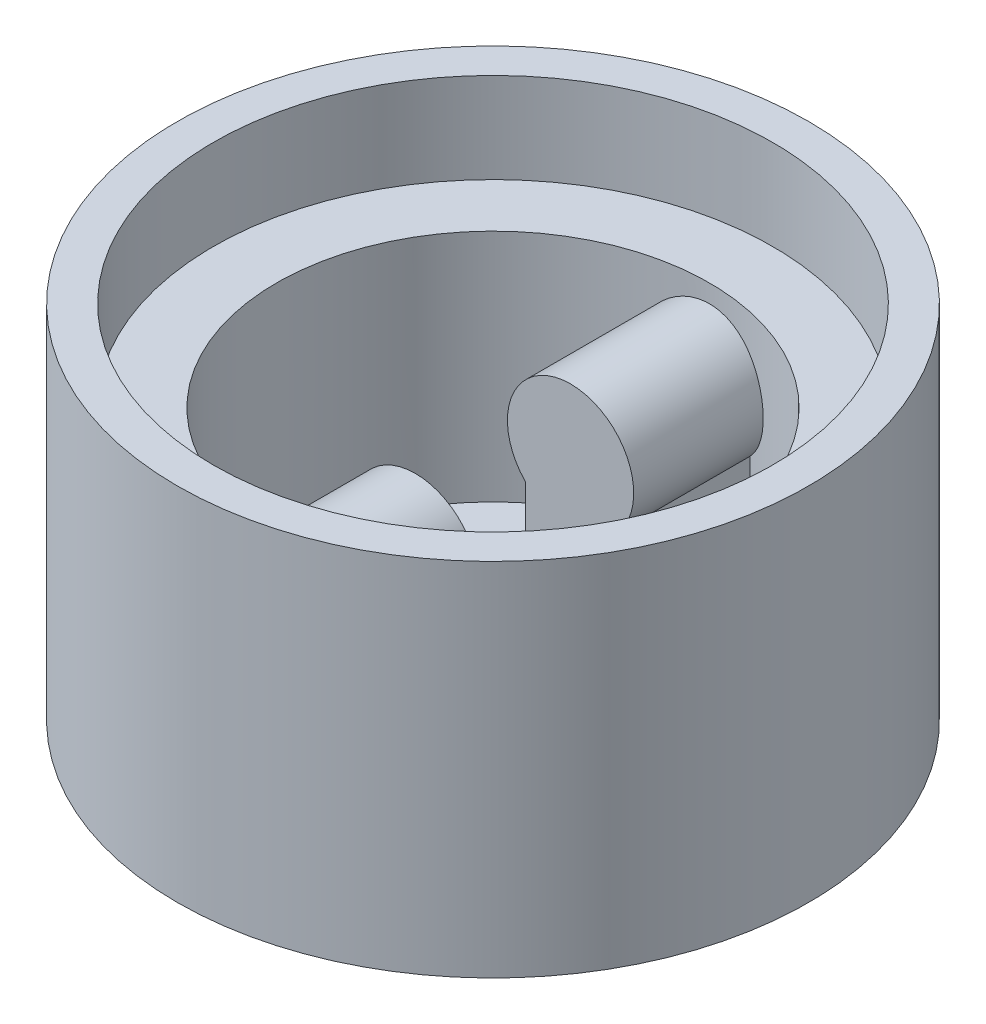
ISO-10303-21;
HEADER;
FILE_DESCRIPTION(('STEP AP214'),'2;1');
FILE_NAME('part.step','',(''),(''),'','','');
FILE_SCHEMA(('AUTOMOTIVE_DESIGN { 1 0 10303 214 1 1 1 1 }'));
ENDSEC;
DATA;
#1=APPLICATION_CONTEXT('core data for automotive mechanical design processes');
#2=APPLICATION_PROTOCOL_DEFINITION('international standard','automotive_design',2000,#1);
#3=PRODUCT_CONTEXT('',#1,'mechanical');
#4=PRODUCT('Part','Part','',(#3));
#5=PRODUCT_RELATED_PRODUCT_CATEGORY('part','',(#4));
#6=PRODUCT_DEFINITION_FORMATION('','',#4);
#7=PRODUCT_DEFINITION_CONTEXT('part definition',#1,'design');
#8=PRODUCT_DEFINITION('design','',#6,#7);
#9=PRODUCT_DEFINITION_SHAPE('','',#8);
#10=(LENGTH_UNIT() NAMED_UNIT(*) SI_UNIT(.MILLI.,.METRE.));
#11=(NAMED_UNIT(*) PLANE_ANGLE_UNIT() SI_UNIT($,.RADIAN.));
#12=(NAMED_UNIT(*) SI_UNIT($,.STERADIAN.) SOLID_ANGLE_UNIT());
#13=UNCERTAINTY_MEASURE_WITH_UNIT(LENGTH_MEASURE(1.E-05),#10,'distance_accuracy_value','');
#14=(GEOMETRIC_REPRESENTATION_CONTEXT(3) GLOBAL_UNCERTAINTY_ASSIGNED_CONTEXT((#13)) GLOBAL_UNIT_ASSIGNED_CONTEXT((#10,
#11,#12)) REPRESENTATION_CONTEXT('',''));
#15=CARTESIAN_POINT('',(0.,0.,0.));
#16=DIRECTION('',(0.,0.,1.));
#17=DIRECTION('',(1.,0.,0.));
#18=AXIS2_PLACEMENT_3D('',#15,#16,#17);
#19=CARTESIAN_POINT('',(2.5,8.05051025721682,-17.502));
#20=DIRECTION('',(1.,0.,0.));
#21=DIRECTION('',(0.,1.,0.));
#22=AXIS2_PLACEMENT_3D('',#19,#20,#21);
#23=PLANE('',#22);
#24=DIRECTION('',(0.,-1.,0.));
#25=VECTOR('',#24,1.);
#26=CARTESIAN_POINT('',(2.5,8.05051025721682,4.3));
#27=LINE('',#26,#25);
#28=CARTESIAN_POINT('',(2.5,8.05051025721682,4.3));
#29=VERTEX_POINT('',#28);
#30=CARTESIAN_POINT('',(2.5,2.,4.3));
#31=VERTEX_POINT('',#30);
#32=EDGE_CURVE('E222',#29,#31,#27,.T.);
#33=ORIENTED_EDGE('',*,*,#32,.F.);
#34=DIRECTION('',(0.,0.,1.));
#35=VECTOR('',#34,1.);
#36=CARTESIAN_POINT('',(2.5,8.05051025721682,-17.502));
#37=LINE('',#36,#35);
#38=CARTESIAN_POINT('',(2.5,8.05051025721682,11.7366945943055));
#39=VERTEX_POINT('',#38);
#40=EDGE_CURVE('E227',#29,#39,#37,.T.);
#41=ORIENTED_EDGE('',*,*,#40,.T.);
#42=DIRECTION('',(0.,1.,0.));
#43=VECTOR('',#42,1.);
#44=CARTESIAN_POINT('',(2.5,-33.9411254969543,11.7366945943055));
#45=LINE('',#44,#43);
#46=CARTESIAN_POINT('',(2.5,2.,11.7366945943055));
#47=VERTEX_POINT('',#46);
#48=EDGE_CURVE('E223',#47,#39,#45,.T.);
#49=ORIENTED_EDGE('',*,*,#48,.F.);
#50=DIRECTION('',(0.,0.,1.));
#51=VECTOR('',#50,1.);
#52=CARTESIAN_POINT('',(2.5,2.,-17.502));
#53=LINE('',#52,#51);
#54=EDGE_CURVE('E226',#31,#47,#53,.T.);
#55=ORIENTED_EDGE('',*,*,#54,.F.);
#56=EDGE_LOOP('',(#33,#41,#49,#55));
#57=FACE_BOUND('',#56,.T.);
#58=ADVANCED_FACE('F43',(#57),#23,.T.);
#59=CARTESIAN_POINT('',(-2.5,8.05051025721682,-17.502));
#60=DIRECTION('',(-1.,0.,0.));
#61=DIRECTION('',(0.,-1.,0.));
#62=AXIS2_PLACEMENT_3D('',#59,#60,#61);
#63=PLANE('',#62);
#64=DIRECTION('',(0.,1.,0.));
#65=VECTOR('',#64,1.);
#66=CARTESIAN_POINT('',(-2.5,8.05051025721682,4.3));
#67=LINE('',#66,#65);
#68=CARTESIAN_POINT('',(-2.5,2.,4.3));
#69=VERTEX_POINT('',#68);
#70=CARTESIAN_POINT('',(-2.5,8.05051025721682,4.3));
#71=VERTEX_POINT('',#70);
#72=EDGE_CURVE('E247',#69,#71,#67,.T.);
#73=ORIENTED_EDGE('',*,*,#72,.F.);
#74=DIRECTION('',(0.,0.,1.));
#75=VECTOR('',#74,1.);
#76=CARTESIAN_POINT('',(-2.5,2.,-17.502));
#77=LINE('',#76,#75);
#78=CARTESIAN_POINT('',(-2.5,2.,11.7366945943055));
#79=VERTEX_POINT('',#78);
#80=EDGE_CURVE('E132',#69,#79,#77,.T.);
#81=ORIENTED_EDGE('',*,*,#80,.T.);
#82=DIRECTION('',(0.,1.,0.));
#83=VECTOR('',#82,1.);
#84=CARTESIAN_POINT('',(-2.5,-33.9411254969543,11.7366945943055));
#85=LINE('',#84,#83);
#86=CARTESIAN_POINT('',(-2.5,8.05051025721682,11.7366945943055));
#87=VERTEX_POINT('',#86);
#88=EDGE_CURVE('E221',#87,#79,#85,.F.);
#89=ORIENTED_EDGE('',*,*,#88,.F.);
#90=DIRECTION('',(0.,0.,1.));
#91=VECTOR('',#90,1.);
#92=CARTESIAN_POINT('',(-2.5,8.05051025721682,-17.502));
#93=LINE('',#92,#91);
#94=EDGE_CURVE('E131',#71,#87,#93,.T.);
#95=ORIENTED_EDGE('',*,*,#94,.F.);
#96=EDGE_LOOP('',(#73,#81,#89,#95));
#97=FACE_BOUND('',#96,.T.);
#98=ADVANCED_FACE('F183',(#97),#63,.T.);
#99=CARTESIAN_POINT('',(0.,10.5,-17.502));
#100=DIRECTION('',(0.,0.,1.));
#101=DIRECTION('',(1.,0.,0.));
#102=AXIS2_PLACEMENT_3D('',#99,#100,#101);
#103=CYLINDRICAL_SURFACE('',#102,3.5);
#104=CARTESIAN_POINT('',(0.,10.5,4.3));
#105=DIRECTION('',(0.,0.,1.));
#106=DIRECTION('',(1.,0.,0.));
#107=AXIS2_PLACEMENT_3D('',#104,#105,#106);
#108=CIRCLE('',#107,3.5);
#109=EDGE_CURVE('E12',#71,#29,#108,.F.);
#110=ORIENTED_EDGE('',*,*,#109,.F.);
#111=ORIENTED_EDGE('',*,*,#94,.T.);
#112=CARTESIAN_POINT('',(2.5,8.05051025721682,11.7366945943055));
#113=CARTESIAN_POINT('',(2.56834051873156,8.12025181782895,11.7221379498669));
#114=CARTESIAN_POINT('',(2.63375256989445,8.19285970576919,11.7075802179565));
#115=CARTESIAN_POINT('',(2.75832361987652,8.34333985492648,11.6788584671173));
#116=CARTESIAN_POINT('',(2.81748198180881,8.42121265100964,11.6646944883971));
#117=CARTESIAN_POINT('',(2.92919556232597,8.58182635230292,11.6371444350884));
#118=CARTESIAN_POINT('',(2.98174360418704,8.66457240770855,11.6237592143137));
#119=CARTESIAN_POINT('',(3.07977544760316,8.83428680913996,11.5981697922698));
#120=CARTESIAN_POINT('',(3.12525958396348,8.92125495479629,11.5859655350373));
#121=CARTESIAN_POINT('',(3.25069244978755,9.18792884896846,11.5516484961383));
#122=CARTESIAN_POINT('',(3.31956788588216,9.37332679349593,11.5318452411198));
#123=CARTESIAN_POINT('',(3.42515121495221,9.75350364135341,11.5009306265399));
#124=CARTESIAN_POINT('',(3.46189025042679,9.9482732692568,11.4898108531795));
#125=CARTESIAN_POINT('',(3.5014218503016,10.335963407757,11.4778247425982));
#126=CARTESIAN_POINT('',(3.50514900316226,10.5287792991368,11.4766761339972));
#127=CARTESIAN_POINT('',(3.48094323339675,10.9122595496523,11.4840406505532));
#128=CARTESIAN_POINT('',(3.45300356945524,11.1029234419367,11.492555832964));
#129=CARTESIAN_POINT('',(3.36726036540803,11.4731512014762,11.5179635411157));
#130=CARTESIAN_POINT('',(3.31000372753786,11.6528531352319,11.5347024313614));
#131=CARTESIAN_POINT('',(3.16777364755536,12.0001452215733,11.5745684422924));
#132=CARTESIAN_POINT('',(3.08279802278894,12.1677344191055,11.5976960660186));
#133=CARTESIAN_POINT('',(2.88452377055656,12.4916512218257,11.6486171473654));
#134=CARTESIAN_POINT('',(2.77043947402524,12.6474786441339,11.6765315202613));
#135=CARTESIAN_POINT('',(2.51836000023699,12.9382165188566,11.7334791612959));
#136=CARTESIAN_POINT('',(2.38035912809404,13.073121974915,11.7625126946398));
#137=CARTESIAN_POINT('',(2.07910695597599,13.3225428484481,11.8195394325368));
#138=CARTESIAN_POINT('',(1.91519212041834,13.4362732228539,11.8474701730347));
#139=CARTESIAN_POINT('',(1.56982295693433,13.6345314942874,11.8981540539232));
#140=CARTESIAN_POINT('',(1.38837054248602,13.7190625725789,11.9209077582597));
#141=CARTESIAN_POINT('',(1.01560782836842,13.8551975419246,11.9583907191921));
#142=CARTESIAN_POINT('',(0.824471259962075,13.9072461649958,11.9732279355597));
#143=CARTESIAN_POINT('',(0.43569465494832,13.9783897445296,11.9936655196741));
#144=CARTESIAN_POINT('',(0.238056303822763,13.9974931739594,11.9992682623607));
#145=CARTESIAN_POINT('',(-0.150498844682945,14.001962752923,12.0005730327965));
#146=CARTESIAN_POINT('',(-0.34140188323521,13.9885169403521,11.9966237126854));
#147=CARTESIAN_POINT('',(-0.718091023130278,13.9308381438656,11.9799789403862));
#148=CARTESIAN_POINT('',(-0.903877206034249,13.8866056509763,11.9672836276905));
#149=CARTESIAN_POINT('',(-1.26453383482043,13.7690681655524,11.9345571747088));
#150=CARTESIAN_POINT('',(-1.43944168816619,13.695870000431,11.9145530105369));
#151=CARTESIAN_POINT('',(-1.77465784235179,13.5226156845334,11.8692558565539));
#152=CARTESIAN_POINT('',(-1.93496341074375,13.422554520798,11.8439618797949));
#153=CARTESIAN_POINT('',(-2.2422172353254,13.1944911072982,11.7897257280454));
#154=CARTESIAN_POINT('',(-2.38853671658714,13.0656638900096,11.7606896110513));
#155=CARTESIAN_POINT('',(-2.65785218019233,12.785517317347,11.7027704731056));
#156=CARTESIAN_POINT('',(-2.78084370731627,12.6341936753845,11.6738874824201));
#157=CARTESIAN_POINT('',(-3.00278726428243,12.3091085079364,11.6188071070843));
#158=CARTESIAN_POINT('',(-3.10112263994059,12.1349116480107,11.5926865925081));
#159=CARTESIAN_POINT('',(-3.26693929491057,11.7715960850588,11.547058160162));
#160=CARTESIAN_POINT('',(-3.33442672446634,11.5824803652728,11.5275489244832));
#161=CARTESIAN_POINT('',(-3.43494818214356,11.1995374445732,11.4979926268581));
#162=CARTESIAN_POINT('',(-3.46878279562809,11.0059378412278,11.4877262751204));
#163=CARTESIAN_POINT('',(-3.50357122535444,10.6155759731169,11.4771660475417));
#164=CARTESIAN_POINT('',(-3.50453625217991,10.4188148095481,11.4768687716233));
#165=CARTESIAN_POINT('',(-3.47413561751602,10.0351212876097,11.486104497629));
#166=CARTESIAN_POINT('',(-3.44391671993113,9.84808800581244,11.4952888261648));
#167=CARTESIAN_POINT('',(-3.35392683297652,9.48178534073657,11.5218639737529));
#168=CARTESIAN_POINT('',(-3.29413869310074,9.30252052896874,11.5392595551607));
#169=CARTESIAN_POINT('',(-3.14610181265011,8.95461464816945,11.5805004448392));
#170=CARTESIAN_POINT('',(-3.05754184489763,8.78611503491022,11.6044158008602));
#171=CARTESIAN_POINT('',(-2.85479089761124,8.46630950056176,11.6559436511595));
#172=CARTESIAN_POINT('',(-2.74064943253736,8.31497120374489,11.6835489622066));
#173=CARTESIAN_POINT('',(-2.57783471983905,8.13188515498862,11.7199081862992));
#174=CARTESIAN_POINT('',(-2.53939662156322,8.09071055155284,11.7283034343946));
#175=CARTESIAN_POINT('',(-2.5,8.05051025721682,11.7366945943055));
#176=B_SPLINE_CURVE_WITH_KNOTS('',3,(#112,#113,#114,#115,#116,#117,#118,#119,#120,#121,#122,
#123,#124,#125,#126,#127,#128,#129,#130,#131,#132,#133,#134,#135,#136,#137,#138,#139,#140,#141,
#142,#143,#144,#145,#146,#147,#148,#149,#150,#151,#152,#153,#154,#155,#156,#157,#158,#159,#160,
#161,#162,#163,#164,#165,#166,#167,#168,#169,#170,#171,#172,#173,#174,#175),.UNSPECIFIED.,.F.,
.F.,(4,2,2,2,2,2,2,2,2,2,2,2,2,2,2,2,2,2,2,2,2,2,2,2,2,2,2,2,2,2,2,4),(0.,0.296079822633368,
0.592189769574819,0.888618473778406,1.18503312397107,1.77814417838256,2.37067982643546,
2.94638484123022,3.52221243664782,4.08766953910046,4.65317117764318,5.23594178449861,
5.81885134868498,6.42030182424253,7.02168675107837,7.61464600169222,8.20745273009185,
8.77895040112151,9.35043895736873,9.91983917934235,10.4893457322036,11.0779638765107,
11.6666943233493,12.2689394613317,12.8710644755362,13.4584956744717,14.0457265206426,
14.6121062916036,15.1788149553939,15.7518700932973,16.3238254849723,16.4946035202305),.UNSPECIFIED.);
#177=EDGE_CURVE('E213',#39,#87,#176,.T.);
#178=ORIENTED_EDGE('',*,*,#177,.F.);
#179=ORIENTED_EDGE('',*,*,#40,.F.);
#180=EDGE_LOOP('',(#110,#111,#178,#179));
#181=FACE_BOUND('',#180,.T.);
#182=ADVANCED_FACE('F189',(#181),#103,.T.);
#183=CARTESIAN_POINT('',(0.,20.,0.));
#184=DIRECTION('',(0.,-1.,0.));
#185=DIRECTION('',(0.,0.,-1.));
#186=AXIS2_PLACEMENT_3D('',#183,#184,#185);
#187=CYLINDRICAL_SURFACE('',#186,17.5);
#188=CARTESIAN_POINT('',(0.,20.,0.));
#189=DIRECTION('',(0.,1.,0.));
#190=DIRECTION('',(0.,0.,1.));
#191=AXIS2_PLACEMENT_3D('',#188,#189,#190);
#192=CIRCLE('',#191,17.5);
#193=CARTESIAN_POINT('',(0.,20.,17.5));
#194=VERTEX_POINT('',#193);
#195=EDGE_CURVE('E255',#194,#194,#192,.T.);
#196=ORIENTED_EDGE('',*,*,#195,.F.);
#197=EDGE_LOOP('',(#196));
#198=FACE_BOUND('',#197,.T.);
#199=CARTESIAN_POINT('',(0.,0.,0.));
#200=DIRECTION('',(0.,1.,0.));
#201=DIRECTION('',(0.,0.,1.));
#202=AXIS2_PLACEMENT_3D('',#199,#200,#201);
#203=CIRCLE('',#202,17.5);
#204=CARTESIAN_POINT('',(0.,0.,17.5));
#205=VERTEX_POINT('',#204);
#206=EDGE_CURVE('E252',#205,#205,#203,.T.);
#207=ORIENTED_EDGE('',*,*,#206,.T.);
#208=EDGE_LOOP('',(#207));
#209=FACE_BOUND('',#208,.T.);
#210=ADVANCED_FACE('F45',(#198,#209),#187,.T.);
#211=CARTESIAN_POINT('',(0.,20.,0.));
#212=DIRECTION('',(0.,1.,0.));
#213=DIRECTION('',(0.,0.,1.));
#214=AXIS2_PLACEMENT_3D('',#211,#212,#213);
#215=PLANE('',#214);
#216=CARTESIAN_POINT('',(0.,20.,0.));
#217=DIRECTION('',(0.,1.,0.));
#218=DIRECTION('',(0.,0.,1.));
#219=AXIS2_PLACEMENT_3D('',#216,#217,#218);
#220=CIRCLE('',#219,15.5);
#221=CARTESIAN_POINT('',(0.,20.,15.5));
#222=VERTEX_POINT('',#221);
#223=EDGE_CURVE('E148',#222,#222,#220,.T.);
#224=ORIENTED_EDGE('',*,*,#223,.F.);
#225=EDGE_LOOP('',(#224));
#226=FACE_BOUND('',#225,.T.);
#227=ORIENTED_EDGE('',*,*,#195,.T.);
#228=EDGE_LOOP('',(#227));
#229=FACE_BOUND('',#228,.T.);
#230=ADVANCED_FACE('F172',(#226,#229),#215,.T.);
#231=CARTESIAN_POINT('',(0.,0.,0.));
#232=DIRECTION('',(0.,1.,0.));
#233=DIRECTION('',(0.,0.,1.));
#234=AXIS2_PLACEMENT_3D('',#231,#232,#233);
#235=PLANE('',#234);
#236=CARTESIAN_POINT('',(0.,0.,0.));
#237=DIRECTION('',(0.,1.,0.));
#238=DIRECTION('',(0.,0.,1.));
#239=AXIS2_PLACEMENT_3D('',#236,#237,#238);
#240=CIRCLE('',#239,2.);
#241=CARTESIAN_POINT('',(0.,0.,2.));
#242=VERTEX_POINT('',#241);
#243=EDGE_CURVE('E240',#242,#242,#240,.T.);
#244=ORIENTED_EDGE('',*,*,#243,.T.);
#245=EDGE_LOOP('',(#244));
#246=FACE_BOUND('',#245,.T.);
#247=ORIENTED_EDGE('',*,*,#206,.F.);
#248=EDGE_LOOP('',(#247));
#249=FACE_BOUND('',#248,.T.);
#250=ADVANCED_FACE('F162',(#246,#249),#235,.F.);
#251=CARTESIAN_POINT('',(0.,15.,0.));
#252=DIRECTION('',(0.,1.,0.));
#253=DIRECTION('',(0.,0.,1.));
#254=AXIS2_PLACEMENT_3D('',#251,#252,#253);
#255=CYLINDRICAL_SURFACE('',#254,15.5);
#256=CARTESIAN_POINT('',(0.,15.,0.));
#257=DIRECTION('',(0.,1.,0.));
#258=DIRECTION('',(0.,0.,1.));
#259=AXIS2_PLACEMENT_3D('',#256,#257,#258);
#260=CIRCLE('',#259,15.5);
#261=CARTESIAN_POINT('',(0.,15.,15.5));
#262=VERTEX_POINT('',#261);
#263=EDGE_CURVE('E257',#262,#262,#260,.T.);
#264=ORIENTED_EDGE('',*,*,#263,.F.);
#265=EDGE_LOOP('',(#264));
#266=FACE_BOUND('',#265,.T.);
#267=ORIENTED_EDGE('',*,*,#223,.T.);
#268=EDGE_LOOP('',(#267));
#269=FACE_BOUND('',#268,.T.);
#270=ADVANCED_FACE('F158',(#266,#269),#255,.F.);
#271=CARTESIAN_POINT('',(0.,15.,0.));
#272=DIRECTION('',(0.,1.,0.));
#273=DIRECTION('',(0.,0.,1.));
#274=AXIS2_PLACEMENT_3D('',#271,#272,#273);
#275=PLANE('',#274);
#276=CARTESIAN_POINT('',(0.,15.,0.));
#277=DIRECTION('',(0.,1.,0.));
#278=DIRECTION('',(0.,0.,1.));
#279=AXIS2_PLACEMENT_3D('',#276,#277,#278);
#280=CIRCLE('',#279,12.);
#281=CARTESIAN_POINT('',(0.,15.,12.));
#282=VERTEX_POINT('',#281);
#283=EDGE_CURVE('E366',#282,#282,#280,.T.);
#284=ORIENTED_EDGE('',*,*,#283,.F.);
#285=EDGE_LOOP('',(#284));
#286=FACE_BOUND('',#285,.T.);
#287=ORIENTED_EDGE('',*,*,#263,.T.);
#288=EDGE_LOOP('',(#287));
#289=FACE_BOUND('',#288,.T.);
#290=ADVANCED_FACE('F155',(#286,#289),#275,.T.);
#291=CARTESIAN_POINT('',(0.,2.,0.));
#292=DIRECTION('',(0.,1.,0.));
#293=DIRECTION('',(0.,0.,1.));
#294=AXIS2_PLACEMENT_3D('',#291,#292,#293);
#295=PLANE('',#294);
#296=CARTESIAN_POINT('',(0.,2.,0.));
#297=DIRECTION('',(0.,1.,0.));
#298=DIRECTION('',(0.,0.,1.));
#299=AXIS2_PLACEMENT_3D('',#296,#297,#298);
#300=CIRCLE('',#299,2.);
#301=CARTESIAN_POINT('',(0.,2.,2.));
#302=VERTEX_POINT('',#301);
#303=EDGE_CURVE('E242',#302,#302,#300,.T.);
#304=ORIENTED_EDGE('',*,*,#303,.F.);
#305=EDGE_LOOP('',(#304));
#306=FACE_BOUND('',#305,.T.);
#307=ORIENTED_EDGE('',*,*,#80,.F.);
#308=DIRECTION('',(-1.,0.,0.));
#309=VECTOR('',#308,1.);
#310=CARTESIAN_POINT('',(-3.5,2.,4.3));
#311=LINE('',#310,#309);
#312=EDGE_CURVE('E126',#31,#69,#311,.T.);
#313=ORIENTED_EDGE('',*,*,#312,.F.);
#314=ORIENTED_EDGE('',*,*,#54,.T.);
#315=CARTESIAN_POINT('',(0.,2.,0.));
#316=DIRECTION('',(0.,1.,0.));
#317=DIRECTION('',(0.,0.,1.));
#318=AXIS2_PLACEMENT_3D('',#315,#316,#317);
#319=CIRCLE('',#318,12.);
#320=CARTESIAN_POINT('',(2.5,2.,-11.7366945943055));
#321=VERTEX_POINT('',#320);
#322=EDGE_CURVE('E235',#321,#47,#319,.F.);
#323=ORIENTED_EDGE('',*,*,#322,.F.);
#324=CARTESIAN_POINT('',(2.5,2.,-4.3));
#325=VERTEX_POINT('',#324);
#326=EDGE_CURVE('E125',#321,#325,#53,.T.);
#327=ORIENTED_EDGE('',*,*,#326,.T.);
#328=DIRECTION('',(1.,0.,0.));
#329=VECTOR('',#328,1.);
#330=CARTESIAN_POINT('',(-3.5,2.,-4.3));
#331=LINE('',#330,#329);
#332=CARTESIAN_POINT('',(-2.5,2.,-4.3));
#333=VERTEX_POINT('',#332);
#334=EDGE_CURVE('E110',#333,#325,#331,.T.);
#335=ORIENTED_EDGE('',*,*,#334,.F.);
#336=CARTESIAN_POINT('',(-2.5,2.,-11.7366945943055));
#337=VERTEX_POINT('',#336);
#338=EDGE_CURVE('E122',#337,#333,#77,.T.);
#339=ORIENTED_EDGE('',*,*,#338,.F.);
#340=EDGE_CURVE('E251',#79,#337,#319,.F.);
#341=ORIENTED_EDGE('',*,*,#340,.F.);
#342=EDGE_LOOP('',(#307,#313,#314,#323,#327,#335,#339,#341));
#343=FACE_BOUND('',#342,.T.);
#344=ADVANCED_FACE('F120',(#306,#343),#295,.T.);
#345=CARTESIAN_POINT('',(0.,-33.9411254969543,0.));
#346=DIRECTION('',(0.,1.,0.));
#347=DIRECTION('',(0.,0.,1.));
#348=AXIS2_PLACEMENT_3D('',#345,#346,#347);
#349=CYLINDRICAL_SURFACE('',#348,12.);
#350=ORIENTED_EDGE('',*,*,#322,.T.);
#351=ORIENTED_EDGE('',*,*,#48,.T.);
#352=ORIENTED_EDGE('',*,*,#177,.T.);
#353=ORIENTED_EDGE('',*,*,#88,.T.);
#354=ORIENTED_EDGE('',*,*,#340,.T.);
#355=DIRECTION('',(0.,1.,0.));
#356=VECTOR('',#355,1.);
#357=CARTESIAN_POINT('',(-2.5,-33.9411254969543,-11.7366945943055));
#358=LINE('',#357,#356);
#359=CARTESIAN_POINT('',(-2.5,8.05051025721682,-11.7366945943055));
#360=VERTEX_POINT('',#359);
#361=EDGE_CURVE('E130',#360,#337,#358,.F.);
#362=ORIENTED_EDGE('',*,*,#361,.F.);
#363=CARTESIAN_POINT('',(2.5,8.05051025721682,-11.7366945943055));
#364=CARTESIAN_POINT('',(2.56834051873156,8.12025181782895,-11.7221379498669));
#365=CARTESIAN_POINT('',(2.63375256989445,8.19285970576919,-11.7075802179565));
#366=CARTESIAN_POINT('',(2.75832361987652,8.34333985492648,-11.6788584671173));
#367=CARTESIAN_POINT('',(2.81748198180881,8.42121265100964,-11.6646944883971));
#368=CARTESIAN_POINT('',(2.92919556232597,8.58182635230292,-11.6371444350884));
#369=CARTESIAN_POINT('',(2.98174360418704,8.66457240770855,-11.6237592143137));
#370=CARTESIAN_POINT('',(3.07977544760316,8.83428680913996,-11.5981697922698));
#371=CARTESIAN_POINT('',(3.12525958396347,8.92125495479629,-11.5859655350373));
#372=CARTESIAN_POINT('',(3.25069244978754,9.18792884896845,-11.5516484961383));
#373=CARTESIAN_POINT('',(3.31956788588216,9.37332679349593,-11.5318452411198));
#374=CARTESIAN_POINT('',(3.42515121495221,9.75350364135341,-11.5009306265399));
#375=CARTESIAN_POINT('',(3.46189025042679,9.9482732692568,-11.4898108531795));
#376=CARTESIAN_POINT('',(3.5014218503016,10.335963407757,-11.4778247425982));
#377=CARTESIAN_POINT('',(3.50514900316226,10.5287792991368,-11.4766761339972));
#378=CARTESIAN_POINT('',(3.48094323339675,10.9122595496523,-11.4840406505532));
#379=CARTESIAN_POINT('',(3.45300356945524,11.1029234419367,-11.492555832964));
#380=CARTESIAN_POINT('',(3.36726036540803,11.4731512014762,-11.5179635411157));
#381=CARTESIAN_POINT('',(3.31000372753786,11.6528531352319,-11.5347024313614));
#382=CARTESIAN_POINT('',(3.16777364755536,12.0001452215733,-11.5745684422924));
#383=CARTESIAN_POINT('',(3.08279802278895,12.1677344191055,-11.5976960660186));
#384=CARTESIAN_POINT('',(2.88452377055656,12.4916512218257,-11.6486171473655));
#385=CARTESIAN_POINT('',(2.77043947402524,12.6474786441339,-11.6765315202613));
#386=CARTESIAN_POINT('',(2.51836000023699,12.9382165188566,-11.7334791612959));
#387=CARTESIAN_POINT('',(2.38035912809405,13.073121974915,-11.7625126946398));
#388=CARTESIAN_POINT('',(2.079106955976,13.3225428484481,-11.8195394325368));
#389=CARTESIAN_POINT('',(1.91519212041834,13.4362732228539,-11.8474701730347));
#390=CARTESIAN_POINT('',(1.56982295693433,13.6345314942874,-11.8981540539232));
#391=CARTESIAN_POINT('',(1.38837054248602,13.7190625725789,-11.9209077582597));
#392=CARTESIAN_POINT('',(1.01560782836842,13.8551975419246,-11.9583907191921));
#393=CARTESIAN_POINT('',(0.824471259962079,13.9072461649958,-11.9732279355597));
#394=CARTESIAN_POINT('',(0.435694654948324,13.9783897445296,-11.9936655196741));
#395=CARTESIAN_POINT('',(0.238056303822766,13.9974931739594,-11.9992682623607));
#396=CARTESIAN_POINT('',(-0.150498844682943,14.001962752923,-12.0005730327965));
#397=CARTESIAN_POINT('',(-0.341401883235208,13.9885169403521,-11.9966237126854));
#398=CARTESIAN_POINT('',(-0.718091023130277,13.9308381438656,-11.9799789403862));
#399=CARTESIAN_POINT('',(-0.903877206034247,13.8866056509763,-11.9672836276905));
#400=CARTESIAN_POINT('',(-1.26453383482042,13.7690681655524,-11.9345571747088));
#401=CARTESIAN_POINT('',(-1.43944168816619,13.695870000431,-11.9145530105369));
#402=CARTESIAN_POINT('',(-1.77465784235178,13.5226156845334,-11.8692558565539));
#403=CARTESIAN_POINT('',(-1.93496341074375,13.422554520798,-11.8439618797949));
#404=CARTESIAN_POINT('',(-2.2422172353254,13.1944911072982,-11.7897257280454));
#405=CARTESIAN_POINT('',(-2.38853671658714,13.0656638900096,-11.7606896110513));
#406=CARTESIAN_POINT('',(-2.65785218019233,12.785517317347,-11.7027704731056));
#407=CARTESIAN_POINT('',(-2.78084370731627,12.6341936753845,-11.6738874824201));
#408=CARTESIAN_POINT('',(-3.00278726428243,12.3091085079364,-11.6188071070843));
#409=CARTESIAN_POINT('',(-3.10112263994058,12.1349116480107,-11.5926865925081));
#410=CARTESIAN_POINT('',(-3.26693929491057,11.7715960850588,-11.547058160162));
#411=CARTESIAN_POINT('',(-3.33442672446634,11.5824803652728,-11.5275489244832));
#412=CARTESIAN_POINT('',(-3.43494818214356,11.1995374445732,-11.4979926268581));
#413=CARTESIAN_POINT('',(-3.46878279562809,11.0059378412278,-11.4877262751204));
#414=CARTESIAN_POINT('',(-3.50357122535444,10.6155759731169,-11.4771660475417));
#415=CARTESIAN_POINT('',(-3.50453625217991,10.4188148095481,-11.4768687716233));
#416=CARTESIAN_POINT('',(-3.47413561751602,10.0351212876097,-11.486104497629));
#417=CARTESIAN_POINT('',(-3.44391671993113,9.84808800581245,-11.4952888261648));
#418=CARTESIAN_POINT('',(-3.35392683297652,9.48178534073657,-11.5218639737529));
#419=CARTESIAN_POINT('',(-3.29413869310074,9.30252052896875,-11.5392595551607));
#420=CARTESIAN_POINT('',(-3.14610181265011,8.95461464816946,-11.5805004448392));
#421=CARTESIAN_POINT('',(-3.05754184489764,8.78611503491022,-11.6044158008602));
#422=CARTESIAN_POINT('',(-2.85479089761124,8.46630950056176,-11.6559436511595));
#423=CARTESIAN_POINT('',(-2.74064943253736,8.31497120374489,-11.6835489622066));
#424=CARTESIAN_POINT('',(-2.57783471983905,8.13188515498862,-11.7199081862992));
#425=CARTESIAN_POINT('',(-2.53939662156322,8.09071055155284,-11.7283034343946));
#426=CARTESIAN_POINT('',(-2.5,8.05051025721682,-11.7366945943055));
#427=B_SPLINE_CURVE_WITH_KNOTS('',3,(#363,#364,#365,#366,#367,#368,#369,#370,#371,#372,#373,
#374,#375,#376,#377,#378,#379,#380,#381,#382,#383,#384,#385,#386,#387,#388,#389,#390,#391,#392,
#393,#394,#395,#396,#397,#398,#399,#400,#401,#402,#403,#404,#405,#406,#407,#408,#409,#410,#411,
#412,#413,#414,#415,#416,#417,#418,#419,#420,#421,#422,#423,#424,#425,#426),.UNSPECIFIED.,.F.,
.F.,(4,2,2,2,2,2,2,2,2,2,2,2,2,2,2,2,2,2,2,2,2,2,2,2,2,2,2,2,2,2,2,4),(0.,0.296079822633369,
0.59218976957482,0.888618473778407,1.18503312397107,1.77814417838256,2.37067982643546,
2.94638484123022,3.52221243664781,4.08766953910045,4.65317117764318,5.23594178449861,
5.81885134868497,6.42030182424253,7.02168675107836,7.61464600169222,8.20745273009184,
8.77895040112151,9.35043895736873,9.91983917934235,10.4893457322036,11.0779638765107,
11.6666943233493,12.2689394613317,12.8710644755362,13.4584956744717,14.0457265206426,
14.6121062916036,15.1788149553939,15.7518700932973,16.3238254849723,16.4946035202305),.UNSPECIFIED.);
#428=CARTESIAN_POINT('',(2.5,8.05051025721682,-11.7366945943055));
#429=VERTEX_POINT('',#428);
#430=EDGE_CURVE('E63',#429,#360,#427,.T.);
#431=ORIENTED_EDGE('',*,*,#430,.F.);
#432=DIRECTION('',(0.,1.,0.));
#433=VECTOR('',#432,1.);
#434=CARTESIAN_POINT('',(2.5,-33.9411254969543,-11.7366945943055));
#435=LINE('',#434,#433);
#436=EDGE_CURVE('E139',#321,#429,#435,.T.);
#437=ORIENTED_EDGE('',*,*,#436,.F.);
#438=EDGE_LOOP('',(#350,#351,#352,#353,#354,#362,#431,#437));
#439=FACE_BOUND('',#438,.T.);
#440=ORIENTED_EDGE('',*,*,#283,.T.);
#441=EDGE_LOOP('',(#440));
#442=FACE_BOUND('',#441,.T.);
#443=ADVANCED_FACE('F166',(#439,#442),#349,.F.);
#444=DIRECTION('',(0.,1.,0.));
#445=VECTOR('',#444,1.);
#446=CARTESIAN_POINT('',(2.5,8.05051025721682,-4.3));
#447=LINE('',#446,#445);
#448=CARTESIAN_POINT('',(2.5,8.05051025721682,-4.3));
#449=VERTEX_POINT('',#448);
#450=EDGE_CURVE('E114',#325,#449,#447,.T.);
#451=ORIENTED_EDGE('',*,*,#450,.F.);
#452=ORIENTED_EDGE('',*,*,#326,.F.);
#453=ORIENTED_EDGE('',*,*,#436,.T.);
#454=EDGE_CURVE('E58',#429,#449,#37,.T.);
#455=ORIENTED_EDGE('',*,*,#454,.T.);
#456=EDGE_LOOP('',(#451,#452,#453,#455));
#457=FACE_BOUND('',#456,.T.);
#458=ADVANCED_FACE('F170',(#457),#23,.T.);
#459=DIRECTION('',(0.,-1.,0.));
#460=VECTOR('',#459,1.);
#461=CARTESIAN_POINT('',(-2.5,8.05051025721682,-4.3));
#462=LINE('',#461,#460);
#463=CARTESIAN_POINT('',(-2.5,8.05051025721682,-4.3));
#464=VERTEX_POINT('',#463);
#465=EDGE_CURVE('E106',#464,#333,#462,.T.);
#466=ORIENTED_EDGE('',*,*,#465,.F.);
#467=EDGE_CURVE('E134',#360,#464,#93,.T.);
#468=ORIENTED_EDGE('',*,*,#467,.F.);
#469=ORIENTED_EDGE('',*,*,#361,.T.);
#470=ORIENTED_EDGE('',*,*,#338,.T.);
#471=EDGE_LOOP('',(#466,#468,#469,#470));
#472=FACE_BOUND('',#471,.T.);
#473=ADVANCED_FACE('F128',(#472),#63,.T.);
#474=ORIENTED_EDGE('',*,*,#467,.T.);
#475=CARTESIAN_POINT('',(0.,10.5,-4.3));
#476=DIRECTION('',(0.,0.,-1.));
#477=DIRECTION('',(-1.,0.,0.));
#478=AXIS2_PLACEMENT_3D('',#475,#476,#477);
#479=CIRCLE('',#478,3.5);
#480=EDGE_CURVE('E51',#449,#464,#479,.F.);
#481=ORIENTED_EDGE('',*,*,#480,.F.);
#482=ORIENTED_EDGE('',*,*,#454,.F.);
#483=ORIENTED_EDGE('',*,*,#430,.T.);
#484=EDGE_LOOP('',(#474,#481,#482,#483));
#485=FACE_BOUND('',#484,.T.);
#486=ADVANCED_FACE('F150',(#485),#103,.T.);
#487=CARTESIAN_POINT('',(-3.5,-9.0887330205033,4.3));
#488=DIRECTION('',(0.,0.,1.));
#489=DIRECTION('',(1.,0.,0.));
#490=AXIS2_PLACEMENT_3D('',#487,#488,#489);
#491=PLANE('',#490);
#492=ORIENTED_EDGE('',*,*,#32,.T.);
#493=ORIENTED_EDGE('',*,*,#312,.T.);
#494=ORIENTED_EDGE('',*,*,#72,.T.);
#495=ORIENTED_EDGE('',*,*,#109,.T.);
#496=EDGE_LOOP('',(#492,#493,#494,#495));
#497=FACE_BOUND('',#496,.T.);
#498=ADVANCED_FACE('F195',(#497),#491,.F.);
#499=CARTESIAN_POINT('',(-3.5,-9.0887330205033,-4.3));
#500=DIRECTION('',(0.,0.,-1.));
#501=DIRECTION('',(-1.,0.,0.));
#502=AXIS2_PLACEMENT_3D('',#499,#500,#501);
#503=PLANE('',#502);
#504=ORIENTED_EDGE('',*,*,#450,.T.);
#505=ORIENTED_EDGE('',*,*,#480,.T.);
#506=ORIENTED_EDGE('',*,*,#465,.T.);
#507=ORIENTED_EDGE('',*,*,#334,.T.);
#508=EDGE_LOOP('',(#504,#505,#506,#507));
#509=FACE_BOUND('',#508,.T.);
#510=ADVANCED_FACE('F109',(#509),#503,.F.);
#511=CARTESIAN_POINT('',(0.,2.,0.));
#512=DIRECTION('',(0.,1.,0.));
#513=DIRECTION('',(0.,0.,1.));
#514=AXIS2_PLACEMENT_3D('',#511,#512,#513);
#515=CYLINDRICAL_SURFACE('',#514,2.);
#516=ORIENTED_EDGE('',*,*,#243,.F.);
#517=EDGE_LOOP('',(#516));
#518=FACE_BOUND('',#517,.T.);
#519=ORIENTED_EDGE('',*,*,#303,.T.);
#520=EDGE_LOOP('',(#519));
#521=FACE_BOUND('',#520,.T.);
#522=ADVANCED_FACE('F206',(#518,#521),#515,.F.);
#523=CLOSED_SHELL('',(#58,#98,#182,#210,#230,#250,#270,#290,#344,#443,#458,#473,#486,#498,#510,#522));
#524=MANIFOLD_SOLID_BREP('B2',#523);
#525=ADVANCED_BREP_SHAPE_REPRESENTATION('',(#18,#524),#14);
#526=SHAPE_DEFINITION_REPRESENTATION(#9,#525);
ENDSEC;
END-ISO-10303-21;
